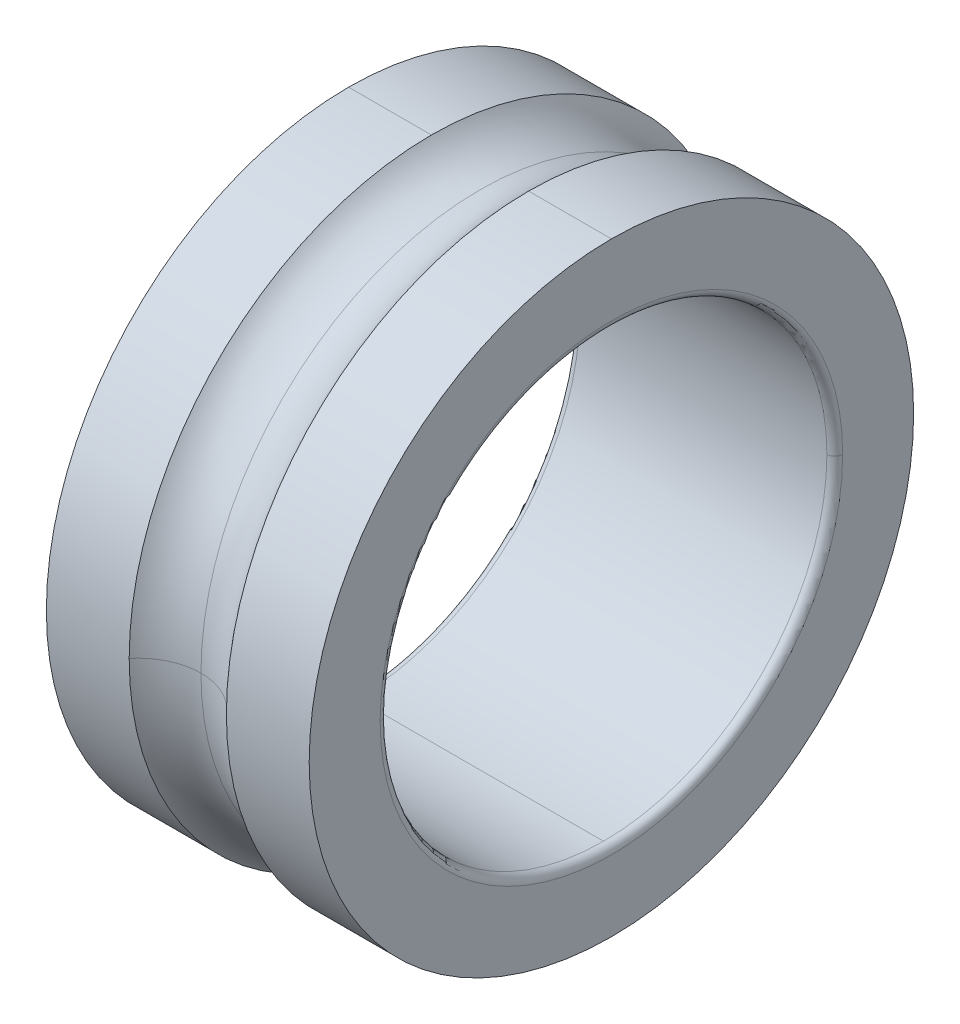
ISO-10303-21;
HEADER;
FILE_DESCRIPTION(('STEP AP214'),'2;1');
FILE_NAME('part.step','',(''),(''),'','','');
FILE_SCHEMA(('AUTOMOTIVE_DESIGN { 1 0 10303 214 1 1 1 1 }'));
ENDSEC;
DATA;
#1=APPLICATION_CONTEXT('core data for automotive mechanical design processes');
#2=APPLICATION_PROTOCOL_DEFINITION('international standard','automotive_design',2000,#1);
#3=PRODUCT_CONTEXT('',#1,'mechanical');
#4=PRODUCT('Part','Part','',(#3));
#5=PRODUCT_RELATED_PRODUCT_CATEGORY('part','',(#4));
#6=PRODUCT_DEFINITION_FORMATION('','',#4);
#7=PRODUCT_DEFINITION_CONTEXT('part definition',#1,'design');
#8=PRODUCT_DEFINITION('design','',#6,#7);
#9=PRODUCT_DEFINITION_SHAPE('','',#8);
#10=(LENGTH_UNIT() NAMED_UNIT(*) SI_UNIT(.MILLI.,.METRE.));
#11=(NAMED_UNIT(*) PLANE_ANGLE_UNIT() SI_UNIT($,.RADIAN.));
#12=(NAMED_UNIT(*) SI_UNIT($,.STERADIAN.) SOLID_ANGLE_UNIT());
#13=UNCERTAINTY_MEASURE_WITH_UNIT(LENGTH_MEASURE(1.E-05),#10,'distance_accuracy_value','');
#14=(GEOMETRIC_REPRESENTATION_CONTEXT(3) GLOBAL_UNCERTAINTY_ASSIGNED_CONTEXT((#13)) GLOBAL_UNIT_ASSIGNED_CONTEXT((#10,
#11,#12)) REPRESENTATION_CONTEXT('',''));
#15=CARTESIAN_POINT('',(0.,0.,0.));
#16=DIRECTION('',(0.,0.,1.));
#17=DIRECTION('',(1.,0.,0.));
#18=AXIS2_PLACEMENT_3D('',#15,#16,#17);
#19=CARTESIAN_POINT('',(8.42454867367814,0.,0.));
#20=DIRECTION('',(1.,0.,0.));
#21=DIRECTION('',(0.,1.,0.));
#22=AXIS2_PLACEMENT_3D('',#19,#20,#21);
#23=CYLINDRICAL_SURFACE('',#22,11.5);
#24=DIRECTION('',(1.,0.,0.));
#25=VECTOR('',#24,1.);
#26=CARTESIAN_POINT('',(8.42454867367814,11.5,0.));
#27=LINE('',#26,#25);
#28=CARTESIAN_POINT('',(6.84909734735627,11.5,0.));
#29=VERTEX_POINT('',#28);
#30=CARTESIAN_POINT('',(10.,11.5,0.));
#31=VERTEX_POINT('',#30);
#32=EDGE_CURVE('E149',#29,#31,#27,.T.);
#33=ORIENTED_EDGE('',*,*,#32,.T.);
#34=CARTESIAN_POINT('',(10.,0.,0.));
#35=DIRECTION('',(1.,0.,0.));
#36=DIRECTION('',(0.,1.,0.));
#37=AXIS2_PLACEMENT_3D('',#34,#35,#36);
#38=CIRCLE('',#37,11.5);
#39=CARTESIAN_POINT('',(10.,-11.5,0.));
#40=VERTEX_POINT('',#39);
#41=EDGE_CURVE('E102',#40,#31,#38,.T.);
#42=ORIENTED_EDGE('',*,*,#41,.F.);
#43=DIRECTION('',(-1.,0.,0.));
#44=VECTOR('',#43,1.);
#45=CARTESIAN_POINT('',(8.42454867367814,-11.5,0.));
#46=LINE('',#45,#44);
#47=CARTESIAN_POINT('',(6.84909734735627,-11.5,0.));
#48=VERTEX_POINT('',#47);
#49=EDGE_CURVE('E155',#40,#48,#46,.T.);
#50=ORIENTED_EDGE('',*,*,#49,.T.);
#51=CARTESIAN_POINT('',(6.84909734735627,0.,0.));
#52=DIRECTION('',(1.,0.,0.));
#53=DIRECTION('',(0.,1.,0.));
#54=AXIS2_PLACEMENT_3D('',#51,#52,#53);
#55=CIRCLE('',#54,11.5);
#56=CARTESIAN_POINT('',(6.84909734735627,0.,-11.5));
#57=VERTEX_POINT('',#56);
#58=EDGE_CURVE('E139',#48,#57,#55,.T.);
#59=ORIENTED_EDGE('',*,*,#58,.T.);
#60=CARTESIAN_POINT('',(6.84909734735627,0.,0.));
#61=DIRECTION('',(1.,0.,0.));
#62=DIRECTION('',(0.,1.,0.));
#63=AXIS2_PLACEMENT_3D('',#60,#61,#62);
#64=CIRCLE('',#63,11.5);
#65=EDGE_CURVE('E146',#57,#29,#64,.T.);
#66=ORIENTED_EDGE('',*,*,#65,.T.);
#67=EDGE_LOOP('',(#33,#42,#50,#59,#66));
#68=FACE_BOUND('',#67,.T.);
#69=ADVANCED_FACE('F16',(#68),#23,.T.);
#70=CARTESIAN_POINT('',(5.,0.,0.));
#71=DIRECTION('',(1.,0.,0.));
#72=DIRECTION('',(0.,0.,-1.));
#73=AXIS2_PLACEMENT_3D('',#70,#71,#72);
#74=TOROIDAL_SURFACE('',#73,13.,2.381);
#75=CARTESIAN_POINT('',(5.,0.,0.));
#76=DIRECTION('',(-1.,0.,0.));
#77=DIRECTION('',(0.,0.,1.));
#78=AXIS2_PLACEMENT_3D('',#75,#76,#77);
#79=CIRCLE('',#78,10.619);
#80=CARTESIAN_POINT('',(5.,0.,10.619));
#81=VERTEX_POINT('',#80);
#82=CARTESIAN_POINT('',(5.,0.,-10.619));
#83=VERTEX_POINT('',#82);
#84=EDGE_CURVE('E234',#81,#83,#79,.T.);
#85=ORIENTED_EDGE('',*,*,#84,.T.);
#86=CARTESIAN_POINT('',(5.,0.,-13.));
#87=DIRECTION('',(0.,-1.,0.));
#88=DIRECTION('',(0.,0.,-1.));
#89=AXIS2_PLACEMENT_3D('',#86,#87,#88);
#90=CIRCLE('',#89,2.381);
#91=CARTESIAN_POINT('',(3.15090265264373,0.,-11.5));
#92=VERTEX_POINT('',#91);
#93=EDGE_CURVE('E173',#83,#92,#90,.T.);
#94=ORIENTED_EDGE('',*,*,#93,.T.);
#95=CARTESIAN_POINT('',(3.15090265264373,0.,0.));
#96=DIRECTION('',(1.,0.,0.));
#97=DIRECTION('',(0.,1.,0.));
#98=AXIS2_PLACEMENT_3D('',#95,#96,#97);
#99=CIRCLE('',#98,11.5);
#100=CARTESIAN_POINT('',(3.15090265264373,11.5,0.));
#101=VERTEX_POINT('',#100);
#102=EDGE_CURVE('E11',#92,#101,#99,.T.);
#103=ORIENTED_EDGE('',*,*,#102,.T.);
#104=CARTESIAN_POINT('',(3.15090265264373,0.,0.));
#105=DIRECTION('',(1.,0.,0.));
#106=DIRECTION('',(0.,1.,0.));
#107=AXIS2_PLACEMENT_3D('',#104,#105,#106);
#108=CIRCLE('',#107,11.5);
#109=CARTESIAN_POINT('',(3.15090265264373,0.,11.5));
#110=VERTEX_POINT('',#109);
#111=EDGE_CURVE('E182',#101,#110,#108,.T.);
#112=ORIENTED_EDGE('',*,*,#111,.T.);
#113=CARTESIAN_POINT('',(5.,0.,13.));
#114=DIRECTION('',(0.,-1.,0.));
#115=DIRECTION('',(0.,0.,1.));
#116=AXIS2_PLACEMENT_3D('',#113,#114,#115);
#117=CIRCLE('',#116,2.381);
#118=EDGE_CURVE('E164',#110,#81,#117,.T.);
#119=ORIENTED_EDGE('',*,*,#118,.T.);
#120=EDGE_LOOP('',(#85,#94,#103,#112,#119));
#121=FACE_BOUND('',#120,.T.);
#122=ADVANCED_FACE('F237',(#121),#74,.F.);
#123=CARTESIAN_POINT('',(1.57545132632186,0.,0.));
#124=DIRECTION('',(1.,0.,0.));
#125=DIRECTION('',(0.,1.,0.));
#126=AXIS2_PLACEMENT_3D('',#123,#124,#125);
#127=CYLINDRICAL_SURFACE('',#126,11.5);
#128=DIRECTION('',(1.,0.,0.));
#129=VECTOR('',#128,1.);
#130=CARTESIAN_POINT('',(1.57545132632186,11.5,0.));
#131=LINE('',#130,#129);
#132=CARTESIAN_POINT('',(0.,11.5,0.));
#133=VERTEX_POINT('',#132);
#134=EDGE_CURVE('E176',#133,#101,#131,.T.);
#135=ORIENTED_EDGE('',*,*,#134,.T.);
#136=ORIENTED_EDGE('',*,*,#102,.F.);
#137=CARTESIAN_POINT('',(3.15090265264373,0.,0.));
#138=DIRECTION('',(1.,0.,0.));
#139=DIRECTION('',(0.,1.,0.));
#140=AXIS2_PLACEMENT_3D('',#137,#138,#139);
#141=CIRCLE('',#140,11.5);
#142=CARTESIAN_POINT('',(3.15090265264373,-11.5,0.));
#143=VERTEX_POINT('',#142);
#144=EDGE_CURVE('E170',#143,#92,#141,.T.);
#145=ORIENTED_EDGE('',*,*,#144,.F.);
#146=DIRECTION('',(-1.,0.,0.));
#147=VECTOR('',#146,1.);
#148=CARTESIAN_POINT('',(1.57545132632186,-11.5,0.));
#149=LINE('',#148,#147);
#150=CARTESIAN_POINT('',(0.,-11.5,0.));
#151=VERTEX_POINT('',#150);
#152=EDGE_CURVE('E180',#143,#151,#149,.T.);
#153=ORIENTED_EDGE('',*,*,#152,.T.);
#154=CARTESIAN_POINT('',(0.,0.,0.));
#155=DIRECTION('',(1.,0.,0.));
#156=DIRECTION('',(0.,1.,0.));
#157=AXIS2_PLACEMENT_3D('',#154,#155,#156);
#158=CIRCLE('',#157,11.5);
#159=EDGE_CURVE('E24',#151,#133,#158,.T.);
#160=ORIENTED_EDGE('',*,*,#159,.T.);
#161=EDGE_LOOP('',(#135,#136,#145,#153,#160));
#162=FACE_BOUND('',#161,.T.);
#163=ADVANCED_FACE('F223',(#162),#127,.T.);
#164=CARTESIAN_POINT('',(0.,10.15,0.));
#165=DIRECTION('',(-1.,0.,0.));
#166=DIRECTION('',(0.,0.,1.));
#167=AXIS2_PLACEMENT_3D('',#164,#165,#166);
#168=PLANE('',#167);
#169=CARTESIAN_POINT('',(0.,0.,0.));
#170=DIRECTION('',(1.,0.,0.));
#171=DIRECTION('',(0.,1.,0.));
#172=AXIS2_PLACEMENT_3D('',#169,#170,#171);
#173=CIRCLE('',#172,8.8);
#174=CARTESIAN_POINT('',(0.,0.,8.8));
#175=VERTEX_POINT('',#174);
#176=CARTESIAN_POINT('',(0.,0.,-8.8));
#177=VERTEX_POINT('',#176);
#178=EDGE_CURVE('E124',#175,#177,#173,.T.);
#179=ORIENTED_EDGE('',*,*,#178,.T.);
#180=CARTESIAN_POINT('',(0.,0.,0.));
#181=DIRECTION('',(1.,0.,0.));
#182=DIRECTION('',(0.,1.,0.));
#183=AXIS2_PLACEMENT_3D('',#180,#181,#182);
#184=CIRCLE('',#183,8.8);
#185=EDGE_CURVE('E195',#177,#175,#184,.T.);
#186=ORIENTED_EDGE('',*,*,#185,.T.);
#187=EDGE_LOOP('',(#179,#186));
#188=FACE_BOUND('',#187,.T.);
#189=CARTESIAN_POINT('',(0.,0.,0.));
#190=DIRECTION('',(1.,0.,0.));
#191=DIRECTION('',(0.,1.,0.));
#192=AXIS2_PLACEMENT_3D('',#189,#190,#191);
#193=CIRCLE('',#192,11.5);
#194=EDGE_CURVE('E177',#133,#151,#193,.T.);
#195=ORIENTED_EDGE('',*,*,#194,.F.);
#196=ORIENTED_EDGE('',*,*,#159,.F.);
#197=EDGE_LOOP('',(#195,#196));
#198=FACE_BOUND('',#197,.T.);
#199=ADVANCED_FACE('F220',(#188,#198),#168,.T.);
#200=CARTESIAN_POINT('',(0.3,0.,0.));
#201=DIRECTION('',(1.,0.,0.));
#202=DIRECTION('',(0.,0.,-1.));
#203=AXIS2_PLACEMENT_3D('',#200,#201,#202);
#204=TOROIDAL_SURFACE('',#203,8.8,0.3);
#205=CARTESIAN_POINT('',(0.3,0.,-8.8));
#206=DIRECTION('',(0.,-1.,0.));
#207=DIRECTION('',(0.,0.,-1.));
#208=AXIS2_PLACEMENT_3D('',#205,#206,#207);
#209=CIRCLE('',#208,0.3);
#210=CARTESIAN_POINT('',(0.3,0.,-8.5));
#211=VERTEX_POINT('',#210);
#212=EDGE_CURVE('E183',#211,#177,#209,.T.);
#213=ORIENTED_EDGE('',*,*,#212,.T.);
#214=ORIENTED_EDGE('',*,*,#178,.F.);
#215=CARTESIAN_POINT('',(0.3,0.,8.8));
#216=DIRECTION('',(0.,-1.,0.));
#217=DIRECTION('',(0.,0.,1.));
#218=AXIS2_PLACEMENT_3D('',#215,#216,#217);
#219=CIRCLE('',#218,0.3);
#220=CARTESIAN_POINT('',(0.3,0.,8.5));
#221=VERTEX_POINT('',#220);
#222=EDGE_CURVE('E192',#175,#221,#219,.T.);
#223=ORIENTED_EDGE('',*,*,#222,.T.);
#224=CARTESIAN_POINT('',(0.3,0.,0.));
#225=DIRECTION('',(1.,0.,0.));
#226=DIRECTION('',(0.,1.,0.));
#227=AXIS2_PLACEMENT_3D('',#224,#225,#226);
#228=CIRCLE('',#227,8.5);
#229=CARTESIAN_POINT('',(0.3,-8.5,0.));
#230=VERTEX_POINT('',#229);
#231=EDGE_CURVE('E122',#221,#230,#228,.T.);
#232=ORIENTED_EDGE('',*,*,#231,.T.);
#233=CARTESIAN_POINT('',(0.3,0.,0.));
#234=DIRECTION('',(1.,0.,0.));
#235=DIRECTION('',(0.,1.,0.));
#236=AXIS2_PLACEMENT_3D('',#233,#234,#235);
#237=CIRCLE('',#236,8.5);
#238=EDGE_CURVE('E200',#230,#211,#237,.T.);
#239=ORIENTED_EDGE('',*,*,#238,.T.);
#240=EDGE_LOOP('',(#213,#214,#223,#232,#239));
#241=FACE_BOUND('',#240,.T.);
#242=ADVANCED_FACE('F219',(#241),#204,.T.);
#243=CARTESIAN_POINT('',(5.,0.,0.));
#244=DIRECTION('',(1.,0.,0.));
#245=DIRECTION('',(0.,1.,0.));
#246=AXIS2_PLACEMENT_3D('',#243,#244,#245);
#247=CYLINDRICAL_SURFACE('',#246,8.5);
#248=DIRECTION('',(1.,0.,0.));
#249=VECTOR('',#248,1.);
#250=CARTESIAN_POINT('',(5.,8.5,0.));
#251=LINE('',#250,#249);
#252=CARTESIAN_POINT('',(0.3,8.5,0.));
#253=VERTEX_POINT('',#252);
#254=CARTESIAN_POINT('',(9.7,8.5,0.));
#255=VERTEX_POINT('',#254);
#256=EDGE_CURVE('E197',#253,#255,#251,.T.);
#257=ORIENTED_EDGE('',*,*,#256,.T.);
#258=CARTESIAN_POINT('',(9.7,0.,0.));
#259=DIRECTION('',(1.,0.,0.));
#260=DIRECTION('',(0.,1.,0.));
#261=AXIS2_PLACEMENT_3D('',#258,#259,#260);
#262=CIRCLE('',#261,8.5);
#263=CARTESIAN_POINT('',(9.7,0.,8.5));
#264=VERTEX_POINT('',#263);
#265=EDGE_CURVE('E119',#255,#264,#262,.T.);
#266=ORIENTED_EDGE('',*,*,#265,.T.);
#267=CARTESIAN_POINT('',(9.7,0.,0.));
#268=DIRECTION('',(1.,0.,0.));
#269=DIRECTION('',(0.,1.,0.));
#270=AXIS2_PLACEMENT_3D('',#267,#268,#269);
#271=CIRCLE('',#270,8.5);
#272=CARTESIAN_POINT('',(9.7,-8.5,0.));
#273=VERTEX_POINT('',#272);
#274=EDGE_CURVE('E31',#264,#273,#271,.T.);
#275=ORIENTED_EDGE('',*,*,#274,.T.);
#276=DIRECTION('',(-1.,0.,0.));
#277=VECTOR('',#276,1.);
#278=CARTESIAN_POINT('',(5.,-8.5,0.));
#279=LINE('',#278,#277);
#280=EDGE_CURVE('E203',#273,#230,#279,.T.);
#281=ORIENTED_EDGE('',*,*,#280,.T.);
#282=ORIENTED_EDGE('',*,*,#231,.F.);
#283=CARTESIAN_POINT('',(0.3,0.,0.));
#284=DIRECTION('',(1.,0.,0.));
#285=DIRECTION('',(0.,1.,0.));
#286=AXIS2_PLACEMENT_3D('',#283,#284,#285);
#287=CIRCLE('',#286,8.5);
#288=EDGE_CURVE('E189',#253,#221,#287,.T.);
#289=ORIENTED_EDGE('',*,*,#288,.F.);
#290=EDGE_LOOP('',(#257,#266,#275,#281,#282,#289));
#291=FACE_BOUND('',#290,.T.);
#292=ADVANCED_FACE('F211',(#291),#247,.F.);
#293=CARTESIAN_POINT('',(9.7,0.,0.));
#294=DIRECTION('',(1.,0.,0.));
#295=DIRECTION('',(0.,0.,-1.));
#296=AXIS2_PLACEMENT_3D('',#293,#294,#295);
#297=TOROIDAL_SURFACE('',#296,8.8,0.3);
#298=CARTESIAN_POINT('',(9.7,0.,-8.8));
#299=DIRECTION('',(0.,-1.,0.));
#300=DIRECTION('',(0.,0.,-1.));
#301=AXIS2_PLACEMENT_3D('',#298,#299,#300);
#302=CIRCLE('',#301,0.3);
#303=CARTESIAN_POINT('',(10.,0.,-8.8));
#304=VERTEX_POINT('',#303);
#305=CARTESIAN_POINT('',(9.7,0.,-8.5));
#306=VERTEX_POINT('',#305);
#307=EDGE_CURVE('E96',#304,#306,#302,.T.);
#308=ORIENTED_EDGE('',*,*,#307,.T.);
#309=CARTESIAN_POINT('',(9.7,0.,0.));
#310=DIRECTION('',(1.,0.,0.));
#311=DIRECTION('',(0.,1.,0.));
#312=AXIS2_PLACEMENT_3D('',#309,#310,#311);
#313=CIRCLE('',#312,8.5);
#314=EDGE_CURVE('E114',#273,#306,#313,.T.);
#315=ORIENTED_EDGE('',*,*,#314,.F.);
#316=ORIENTED_EDGE('',*,*,#274,.F.);
#317=CARTESIAN_POINT('',(9.7,0.,8.8));
#318=DIRECTION('',(0.,-1.,0.));
#319=DIRECTION('',(0.,0.,1.));
#320=AXIS2_PLACEMENT_3D('',#317,#318,#319);
#321=CIRCLE('',#320,0.3);
#322=CARTESIAN_POINT('',(10.,0.,8.8));
#323=VERTEX_POINT('',#322);
#324=EDGE_CURVE('E99',#264,#323,#321,.T.);
#325=ORIENTED_EDGE('',*,*,#324,.T.);
#326=CARTESIAN_POINT('',(10.,0.,0.));
#327=DIRECTION('',(1.,0.,0.));
#328=DIRECTION('',(0.,1.,0.));
#329=AXIS2_PLACEMENT_3D('',#326,#327,#328);
#330=CIRCLE('',#329,8.8);
#331=EDGE_CURVE('E92',#323,#304,#330,.T.);
#332=ORIENTED_EDGE('',*,*,#331,.T.);
#333=EDGE_LOOP('',(#308,#315,#316,#325,#332));
#334=FACE_BOUND('',#333,.T.);
#335=ADVANCED_FACE('F94',(#334),#297,.T.);
#336=CARTESIAN_POINT('',(10.,10.15,0.));
#337=DIRECTION('',(1.,0.,0.));
#338=DIRECTION('',(0.,1.,0.));
#339=AXIS2_PLACEMENT_3D('',#336,#337,#338);
#340=PLANE('',#339);
#341=CARTESIAN_POINT('',(10.,0.,0.));
#342=DIRECTION('',(1.,0.,0.));
#343=DIRECTION('',(0.,1.,0.));
#344=AXIS2_PLACEMENT_3D('',#341,#342,#343);
#345=CIRCLE('',#344,8.8);
#346=EDGE_CURVE('E104',#304,#323,#345,.T.);
#347=ORIENTED_EDGE('',*,*,#346,.F.);
#348=ORIENTED_EDGE('',*,*,#331,.F.);
#349=EDGE_LOOP('',(#347,#348));
#350=FACE_BOUND('',#349,.T.);
#351=CARTESIAN_POINT('',(10.,0.,0.));
#352=DIRECTION('',(1.,0.,0.));
#353=DIRECTION('',(0.,1.,0.));
#354=AXIS2_PLACEMENT_3D('',#351,#352,#353);
#355=CIRCLE('',#354,11.5);
#356=EDGE_CURVE('E157',#31,#40,#355,.T.);
#357=ORIENTED_EDGE('',*,*,#356,.T.);
#358=ORIENTED_EDGE('',*,*,#41,.T.);
#359=EDGE_LOOP('',(#357,#358));
#360=FACE_BOUND('',#359,.T.);
#361=ADVANCED_FACE('F105',(#350,#360),#340,.T.);
#362=CARTESIAN_POINT('',(9.7,0.,0.));
#363=DIRECTION('',(1.,0.,0.));
#364=DIRECTION('',(0.,0.,-1.));
#365=AXIS2_PLACEMENT_3D('',#362,#363,#364);
#366=TOROIDAL_SURFACE('',#365,8.8,0.3);
#367=ORIENTED_EDGE('',*,*,#307,.F.);
#368=ORIENTED_EDGE('',*,*,#346,.T.);
#369=ORIENTED_EDGE('',*,*,#324,.F.);
#370=ORIENTED_EDGE('',*,*,#265,.F.);
#371=CARTESIAN_POINT('',(9.7,0.,0.));
#372=DIRECTION('',(1.,0.,0.));
#373=DIRECTION('',(0.,1.,0.));
#374=AXIS2_PLACEMENT_3D('',#371,#372,#373);
#375=CIRCLE('',#374,8.5);
#376=EDGE_CURVE('E111',#306,#255,#375,.T.);
#377=ORIENTED_EDGE('',*,*,#376,.F.);
#378=EDGE_LOOP('',(#367,#368,#369,#370,#377));
#379=FACE_BOUND('',#378,.T.);
#380=ADVANCED_FACE('F109',(#379),#366,.T.);
#381=CARTESIAN_POINT('',(5.,0.,0.));
#382=DIRECTION('',(1.,0.,0.));
#383=DIRECTION('',(0.,1.,0.));
#384=AXIS2_PLACEMENT_3D('',#381,#382,#383);
#385=CYLINDRICAL_SURFACE('',#384,8.5);
#386=ORIENTED_EDGE('',*,*,#256,.F.);
#387=CARTESIAN_POINT('',(0.3,0.,0.));
#388=DIRECTION('',(1.,0.,0.));
#389=DIRECTION('',(0.,1.,0.));
#390=AXIS2_PLACEMENT_3D('',#387,#388,#389);
#391=CIRCLE('',#390,8.5);
#392=EDGE_CURVE('E186',#211,#253,#391,.T.);
#393=ORIENTED_EDGE('',*,*,#392,.F.);
#394=ORIENTED_EDGE('',*,*,#238,.F.);
#395=ORIENTED_EDGE('',*,*,#280,.F.);
#396=ORIENTED_EDGE('',*,*,#314,.T.);
#397=ORIENTED_EDGE('',*,*,#376,.T.);
#398=EDGE_LOOP('',(#386,#393,#394,#395,#396,#397));
#399=FACE_BOUND('',#398,.T.);
#400=ADVANCED_FACE('F207',(#399),#385,.F.);
#401=CARTESIAN_POINT('',(0.3,0.,0.));
#402=DIRECTION('',(1.,0.,0.));
#403=DIRECTION('',(0.,0.,-1.));
#404=AXIS2_PLACEMENT_3D('',#401,#402,#403);
#405=TOROIDAL_SURFACE('',#404,8.8,0.3);
#406=ORIENTED_EDGE('',*,*,#212,.F.);
#407=ORIENTED_EDGE('',*,*,#392,.T.);
#408=ORIENTED_EDGE('',*,*,#288,.T.);
#409=ORIENTED_EDGE('',*,*,#222,.F.);
#410=ORIENTED_EDGE('',*,*,#185,.F.);
#411=EDGE_LOOP('',(#406,#407,#408,#409,#410));
#412=FACE_BOUND('',#411,.T.);
#413=ADVANCED_FACE('F216',(#412),#405,.T.);
#414=CARTESIAN_POINT('',(1.57545132632186,0.,0.));
#415=DIRECTION('',(1.,0.,0.));
#416=DIRECTION('',(0.,1.,0.));
#417=AXIS2_PLACEMENT_3D('',#414,#415,#416);
#418=CYLINDRICAL_SURFACE('',#417,11.5);
#419=ORIENTED_EDGE('',*,*,#134,.F.);
#420=ORIENTED_EDGE('',*,*,#194,.T.);
#421=ORIENTED_EDGE('',*,*,#152,.F.);
#422=CARTESIAN_POINT('',(3.15090265264373,0.,0.));
#423=DIRECTION('',(1.,0.,0.));
#424=DIRECTION('',(0.,1.,0.));
#425=AXIS2_PLACEMENT_3D('',#422,#423,#424);
#426=CIRCLE('',#425,11.5);
#427=EDGE_CURVE('E167',#110,#143,#426,.T.);
#428=ORIENTED_EDGE('',*,*,#427,.F.);
#429=ORIENTED_EDGE('',*,*,#111,.F.);
#430=EDGE_LOOP('',(#419,#420,#421,#428,#429));
#431=FACE_BOUND('',#430,.T.);
#432=ADVANCED_FACE('F230',(#431),#418,.T.);
#433=CARTESIAN_POINT('',(5.,0.,0.));
#434=DIRECTION('',(1.,0.,0.));
#435=DIRECTION('',(0.,0.,-1.));
#436=AXIS2_PLACEMENT_3D('',#433,#434,#435);
#437=TOROIDAL_SURFACE('',#436,13.,2.381);
#438=CARTESIAN_POINT('',(5.,0.,0.));
#439=DIRECTION('',(-1.,0.,0.));
#440=DIRECTION('',(0.,0.,1.));
#441=AXIS2_PLACEMENT_3D('',#438,#439,#440);
#442=CIRCLE('',#441,10.619);
#443=EDGE_CURVE('E142',#83,#81,#442,.T.);
#444=ORIENTED_EDGE('',*,*,#443,.T.);
#445=ORIENTED_EDGE('',*,*,#118,.F.);
#446=ORIENTED_EDGE('',*,*,#427,.T.);
#447=ORIENTED_EDGE('',*,*,#144,.T.);
#448=ORIENTED_EDGE('',*,*,#93,.F.);
#449=EDGE_LOOP('',(#444,#445,#446,#447,#448));
#450=FACE_BOUND('',#449,.T.);
#451=ADVANCED_FACE('F242',(#450),#437,.F.);
#452=CARTESIAN_POINT('',(8.42454867367814,0.,0.));
#453=DIRECTION('',(1.,0.,0.));
#454=DIRECTION('',(0.,1.,0.));
#455=AXIS2_PLACEMENT_3D('',#452,#453,#454);
#456=CYLINDRICAL_SURFACE('',#455,11.5);
#457=ORIENTED_EDGE('',*,*,#32,.F.);
#458=CARTESIAN_POINT('',(6.84909734735627,0.,0.));
#459=DIRECTION('',(1.,0.,0.));
#460=DIRECTION('',(0.,1.,0.));
#461=AXIS2_PLACEMENT_3D('',#458,#459,#460);
#462=CIRCLE('',#461,11.5);
#463=CARTESIAN_POINT('',(6.84909734735627,0.,11.5));
#464=VERTEX_POINT('',#463);
#465=EDGE_CURVE('E143',#29,#464,#462,.T.);
#466=ORIENTED_EDGE('',*,*,#465,.T.);
#467=CARTESIAN_POINT('',(6.84909734735627,0.,0.));
#468=DIRECTION('',(1.,0.,0.));
#469=DIRECTION('',(0.,1.,0.));
#470=AXIS2_PLACEMENT_3D('',#467,#468,#469);
#471=CIRCLE('',#470,11.5);
#472=EDGE_CURVE('E141',#464,#48,#471,.T.);
#473=ORIENTED_EDGE('',*,*,#472,.T.);
#474=ORIENTED_EDGE('',*,*,#49,.F.);
#475=ORIENTED_EDGE('',*,*,#356,.F.);
#476=EDGE_LOOP('',(#457,#466,#473,#474,#475));
#477=FACE_BOUND('',#476,.T.);
#478=ADVANCED_FACE('F273',(#477),#456,.T.);
#479=CARTESIAN_POINT('',(5.,0.,0.));
#480=DIRECTION('',(1.,0.,0.));
#481=DIRECTION('',(0.,0.,-1.));
#482=AXIS2_PLACEMENT_3D('',#479,#480,#481);
#483=TOROIDAL_SURFACE('',#482,13.,2.381);
#484=ORIENTED_EDGE('',*,*,#443,.F.);
#485=CARTESIAN_POINT('',(5.,0.,-13.));
#486=DIRECTION('',(0.,-1.,0.));
#487=DIRECTION('',(0.,0.,-1.));
#488=AXIS2_PLACEMENT_3D('',#485,#486,#487);
#489=CIRCLE('',#488,2.381);
#490=EDGE_CURVE('E152',#57,#83,#489,.T.);
#491=ORIENTED_EDGE('',*,*,#490,.F.);
#492=ORIENTED_EDGE('',*,*,#58,.F.);
#493=ORIENTED_EDGE('',*,*,#472,.F.);
#494=CARTESIAN_POINT('',(5.,0.,13.));
#495=DIRECTION('',(0.,-1.,0.));
#496=DIRECTION('',(0.,0.,1.));
#497=AXIS2_PLACEMENT_3D('',#494,#495,#496);
#498=CIRCLE('',#497,2.381);
#499=EDGE_CURVE('E137',#81,#464,#498,.T.);
#500=ORIENTED_EDGE('',*,*,#499,.F.);
#501=EDGE_LOOP('',(#484,#491,#492,#493,#500));
#502=FACE_BOUND('',#501,.T.);
#503=ADVANCED_FACE('F251',(#502),#483,.F.);
#504=CARTESIAN_POINT('',(5.,0.,0.));
#505=DIRECTION('',(1.,0.,0.));
#506=DIRECTION('',(0.,0.,-1.));
#507=AXIS2_PLACEMENT_3D('',#504,#505,#506);
#508=TOROIDAL_SURFACE('',#507,13.,2.381);
#509=ORIENTED_EDGE('',*,*,#84,.F.);
#510=ORIENTED_EDGE('',*,*,#499,.T.);
#511=ORIENTED_EDGE('',*,*,#465,.F.);
#512=ORIENTED_EDGE('',*,*,#65,.F.);
#513=ORIENTED_EDGE('',*,*,#490,.T.);
#514=EDGE_LOOP('',(#509,#510,#511,#512,#513));
#515=FACE_BOUND('',#514,.T.);
#516=ADVANCED_FACE('F255',(#515),#508,.F.);
#517=CLOSED_SHELL('',(#69,#122,#163,#199,#242,#292,#335,#361,#380,#400,#413,#432,#451,#478,#503,#516));
#518=MANIFOLD_SOLID_BREP('B1',#517);
#519=ADVANCED_BREP_SHAPE_REPRESENTATION('',(#18,#518),#14);
#520=SHAPE_DEFINITION_REPRESENTATION(#9,#519);
ENDSEC;
END-ISO-10303-21;
